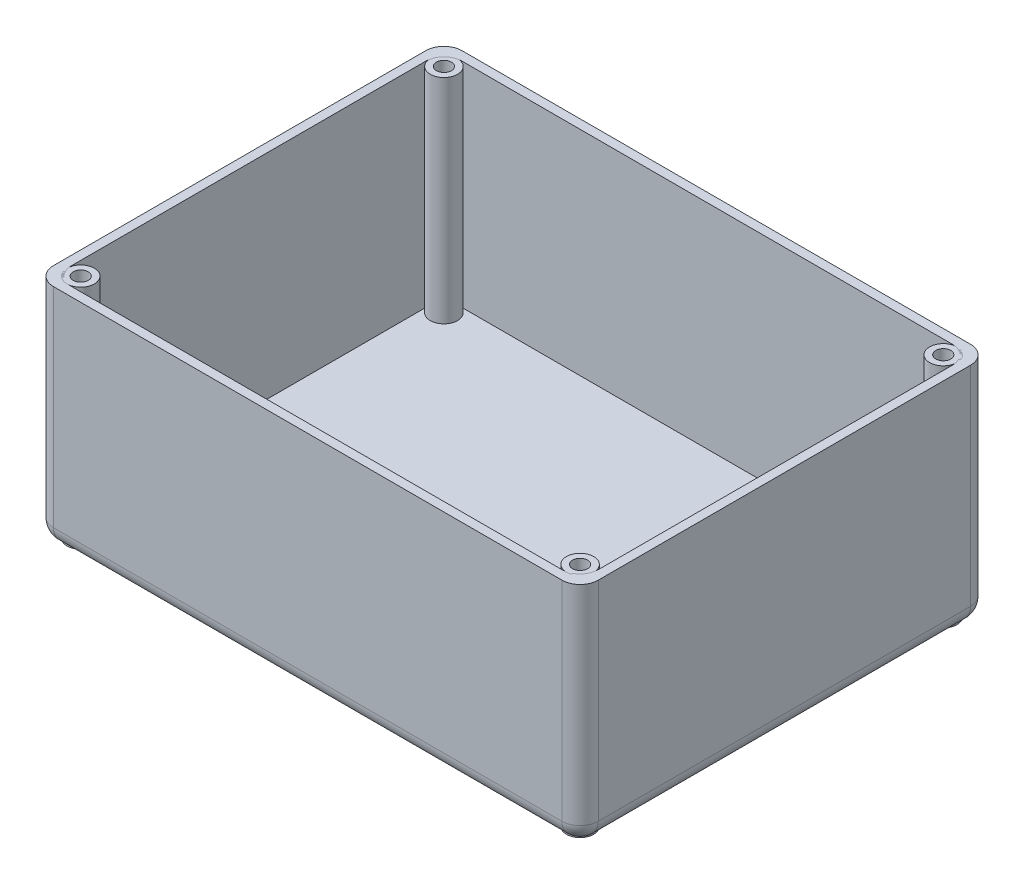
ISO-10303-21;
HEADER;
FILE_DESCRIPTION(('STEP AP214'),'2;1');
FILE_NAME('part.step','',(''),(''),'','','');
FILE_SCHEMA(('AUTOMOTIVE_DESIGN { 1 0 10303 214 1 1 1 1 }'));
ENDSEC;
DATA;
#1=APPLICATION_CONTEXT('core data for automotive mechanical design processes');
#2=APPLICATION_PROTOCOL_DEFINITION('international standard','automotive_design',2000,#1);
#3=PRODUCT_CONTEXT('',#1,'mechanical');
#4=PRODUCT('Part','Part','',(#3));
#5=PRODUCT_RELATED_PRODUCT_CATEGORY('part','',(#4));
#6=PRODUCT_DEFINITION_FORMATION('','',#4);
#7=PRODUCT_DEFINITION_CONTEXT('part definition',#1,'design');
#8=PRODUCT_DEFINITION('design','',#6,#7);
#9=PRODUCT_DEFINITION_SHAPE('','',#8);
#10=(LENGTH_UNIT() NAMED_UNIT(*) SI_UNIT(.MILLI.,.METRE.));
#11=(NAMED_UNIT(*) PLANE_ANGLE_UNIT() SI_UNIT($,.RADIAN.));
#12=(NAMED_UNIT(*) SI_UNIT($,.STERADIAN.) SOLID_ANGLE_UNIT());
#13=UNCERTAINTY_MEASURE_WITH_UNIT(LENGTH_MEASURE(1.E-05),#10,'distance_accuracy_value','');
#14=(GEOMETRIC_REPRESENTATION_CONTEXT(3) GLOBAL_UNCERTAINTY_ASSIGNED_CONTEXT((#13)) GLOBAL_UNIT_ASSIGNED_CONTEXT((#10,
#11,#12)) REPRESENTATION_CONTEXT('',''));
#15=CARTESIAN_POINT('',(0.,0.,0.));
#16=DIRECTION('',(0.,0.,1.));
#17=DIRECTION('',(1.,0.,0.));
#18=AXIS2_PLACEMENT_3D('',#15,#16,#17);
#19=CARTESIAN_POINT('',(39.9214659685864,50.,-28.4554973821989));
#20=DIRECTION('',(0.,-1.,0.));
#21=DIRECTION('',(0.,0.,-1.));
#22=AXIS2_PLACEMENT_3D('',#19,#20,#21);
#23=CYLINDRICAL_SURFACE('',#22,3.);
#24=CARTESIAN_POINT('',(39.9214659685864,50.,-28.4554973821989));
#25=DIRECTION('',(0.,-1.,0.));
#26=DIRECTION('',(0.,0.,-1.));
#27=AXIS2_PLACEMENT_3D('',#24,#25,#26);
#28=CIRCLE('',#27,3.);
#29=CARTESIAN_POINT('',(39.9214659685864,50.,-31.455497382199));
#30=VERTEX_POINT('',#29);
#31=EDGE_CURVE('E11',#30,#30,#28,.T.);
#32=ORIENTED_EDGE('',*,*,#31,.T.);
#33=EDGE_LOOP('',(#32));
#34=FACE_BOUND('',#33,.T.);
#35=CARTESIAN_POINT('',(39.9214659685864,0.,-28.4554973821989));
#36=DIRECTION('',(0.,-1.,0.));
#37=DIRECTION('',(0.,0.,-1.));
#38=AXIS2_PLACEMENT_3D('',#35,#36,#37);
#39=CIRCLE('',#38,3.);
#40=CARTESIAN_POINT('',(39.9214659685864,0.,-31.455497382199));
#41=VERTEX_POINT('',#40);
#42=EDGE_CURVE('E47',#41,#41,#39,.T.);
#43=ORIENTED_EDGE('',*,*,#42,.F.);
#44=EDGE_LOOP('',(#43));
#45=FACE_BOUND('',#44,.T.);
#46=ADVANCED_FACE('F44',(#34,#45),#23,.T.);
#47=CARTESIAN_POINT('',(39.9214659685864,50.,-28.4554973821989));
#48=DIRECTION('',(0.,-1.,0.));
#49=DIRECTION('',(0.,0.,-1.));
#50=AXIS2_PLACEMENT_3D('',#47,#48,#49);
#51=PLANE('',#50);
#52=CARTESIAN_POINT('',(39.9214659685864,50.,-28.4554973821989));
#53=DIRECTION('',(0.,-1.,0.));
#54=DIRECTION('',(0.,0.,-1.));
#55=AXIS2_PLACEMENT_3D('',#52,#53,#54);
#56=CIRCLE('',#55,1.65);
#57=CARTESIAN_POINT('',(39.9214659685864,50.,-30.105497382199));
#58=VERTEX_POINT('',#57);
#59=EDGE_CURVE('E54',#58,#58,#56,.T.);
#60=ORIENTED_EDGE('',*,*,#59,.T.);
#61=EDGE_LOOP('',(#60));
#62=FACE_BOUND('',#61,.T.);
#63=ORIENTED_EDGE('',*,*,#31,.F.);
#64=EDGE_LOOP('',(#63));
#65=FACE_BOUND('',#64,.T.);
#66=ADVANCED_FACE('F62',(#62,#65),#51,.F.);
#67=CARTESIAN_POINT('',(39.9214659685864,0.,-28.4554973821989));
#68=DIRECTION('',(0.,-1.,0.));
#69=DIRECTION('',(0.,0.,-1.));
#70=AXIS2_PLACEMENT_3D('',#67,#68,#69);
#71=PLANE('',#70);
#72=CARTESIAN_POINT('',(39.9214659685864,0.,-28.4554973821989));
#73=DIRECTION('',(0.,-1.,0.));
#74=DIRECTION('',(0.,0.,-1.));
#75=AXIS2_PLACEMENT_3D('',#72,#73,#74);
#76=CIRCLE('',#75,1.65);
#77=CARTESIAN_POINT('',(39.9214659685864,0.,-30.105497382199));
#78=VERTEX_POINT('',#77);
#79=EDGE_CURVE('E56',#78,#78,#76,.T.);
#80=ORIENTED_EDGE('',*,*,#79,.F.);
#81=EDGE_LOOP('',(#80));
#82=FACE_BOUND('',#81,.T.);
#83=ORIENTED_EDGE('',*,*,#42,.T.);
#84=EDGE_LOOP('',(#83));
#85=FACE_BOUND('',#84,.T.);
#86=ADVANCED_FACE('F68',(#82,#85),#71,.T.);
#87=CARTESIAN_POINT('',(39.9214659685864,50.,-28.4554973821989));
#88=DIRECTION('',(0.,-1.,0.));
#89=DIRECTION('',(0.,0.,-1.));
#90=AXIS2_PLACEMENT_3D('',#87,#88,#89);
#91=CYLINDRICAL_SURFACE('',#90,1.65);
#92=ORIENTED_EDGE('',*,*,#59,.F.);
#93=EDGE_LOOP('',(#92));
#94=FACE_BOUND('',#93,.T.);
#95=ORIENTED_EDGE('',*,*,#79,.T.);
#96=EDGE_LOOP('',(#95));
#97=FACE_BOUND('',#96,.T.);
#98=ADVANCED_FACE('F65',(#94,#97),#91,.F.);
#99=CLOSED_SHELL('',(#46,#66,#86,#98));
#100=MANIFOLD_SOLID_BREP('B2',#99);
#101=CARTESIAN_POINT('',(-70.0785340314136,50.,51.544502617801));
#102=DIRECTION('',(0.,-1.,0.));
#103=DIRECTION('',(0.,0.,-1.));
#104=AXIS2_PLACEMENT_3D('',#101,#102,#103);
#105=CYLINDRICAL_SURFACE('',#104,3.00000000000001);
#106=CARTESIAN_POINT('',(-70.0785340314136,50.,51.544502617801));
#107=DIRECTION('',(0.,-1.,0.));
#108=DIRECTION('',(0.,0.,-1.));
#109=AXIS2_PLACEMENT_3D('',#106,#107,#108);
#110=CIRCLE('',#109,3.00000000000001);
#111=CARTESIAN_POINT('',(-70.0785340314136,50.,48.544502617801));
#112=VERTEX_POINT('',#111);
#113=EDGE_CURVE('E43',#112,#112,#110,.T.);
#114=ORIENTED_EDGE('',*,*,#113,.T.);
#115=EDGE_LOOP('',(#114));
#116=FACE_BOUND('',#115,.T.);
#117=CARTESIAN_POINT('',(-70.0785340314136,0.,51.544502617801));
#118=DIRECTION('',(0.,-1.,0.));
#119=DIRECTION('',(0.,0.,-1.));
#120=AXIS2_PLACEMENT_3D('',#117,#118,#119);
#121=CIRCLE('',#120,3.00000000000001);
#122=CARTESIAN_POINT('',(-70.0785340314136,0.,48.544502617801));
#123=VERTEX_POINT('',#122);
#124=EDGE_CURVE('E117',#123,#123,#121,.T.);
#125=ORIENTED_EDGE('',*,*,#124,.F.);
#126=EDGE_LOOP('',(#125));
#127=FACE_BOUND('',#126,.T.);
#128=ADVANCED_FACE('F114',(#116,#127),#105,.T.);
#129=CARTESIAN_POINT('',(-70.0785340314136,50.,51.544502617801));
#130=DIRECTION('',(0.,-1.,0.));
#131=DIRECTION('',(0.,0.,-1.));
#132=AXIS2_PLACEMENT_3D('',#129,#130,#131);
#133=PLANE('',#132);
#134=CARTESIAN_POINT('',(-70.0785340314136,50.,51.544502617801));
#135=DIRECTION('',(0.,-1.,0.));
#136=DIRECTION('',(0.,0.,-1.));
#137=AXIS2_PLACEMENT_3D('',#134,#135,#136);
#138=CIRCLE('',#137,1.65);
#139=CARTESIAN_POINT('',(-70.0785340314136,50.,49.894502617801));
#140=VERTEX_POINT('',#139);
#141=EDGE_CURVE('E124',#140,#140,#138,.T.);
#142=ORIENTED_EDGE('',*,*,#141,.T.);
#143=EDGE_LOOP('',(#142));
#144=FACE_BOUND('',#143,.T.);
#145=ORIENTED_EDGE('',*,*,#113,.F.);
#146=EDGE_LOOP('',(#145));
#147=FACE_BOUND('',#146,.T.);
#148=ADVANCED_FACE('F132',(#144,#147),#133,.F.);
#149=CARTESIAN_POINT('',(-70.0785340314136,0.,51.544502617801));
#150=DIRECTION('',(0.,-1.,0.));
#151=DIRECTION('',(0.,0.,-1.));
#152=AXIS2_PLACEMENT_3D('',#149,#150,#151);
#153=PLANE('',#152);
#154=CARTESIAN_POINT('',(-70.0785340314136,0.,51.544502617801));
#155=DIRECTION('',(0.,-1.,0.));
#156=DIRECTION('',(0.,0.,-1.));
#157=AXIS2_PLACEMENT_3D('',#154,#155,#156);
#158=CIRCLE('',#157,1.65);
#159=CARTESIAN_POINT('',(-70.0785340314136,0.,49.894502617801));
#160=VERTEX_POINT('',#159);
#161=EDGE_CURVE('E126',#160,#160,#158,.T.);
#162=ORIENTED_EDGE('',*,*,#161,.F.);
#163=EDGE_LOOP('',(#162));
#164=FACE_BOUND('',#163,.T.);
#165=ORIENTED_EDGE('',*,*,#124,.T.);
#166=EDGE_LOOP('',(#165));
#167=FACE_BOUND('',#166,.T.);
#168=ADVANCED_FACE('F138',(#164,#167),#153,.T.);
#169=CARTESIAN_POINT('',(-70.0785340314136,50.,51.544502617801));
#170=DIRECTION('',(0.,-1.,0.));
#171=DIRECTION('',(0.,0.,-1.));
#172=AXIS2_PLACEMENT_3D('',#169,#170,#171);
#173=CYLINDRICAL_SURFACE('',#172,1.65);
#174=ORIENTED_EDGE('',*,*,#141,.F.);
#175=EDGE_LOOP('',(#174));
#176=FACE_BOUND('',#175,.T.);
#177=ORIENTED_EDGE('',*,*,#161,.T.);
#178=EDGE_LOOP('',(#177));
#179=FACE_BOUND('',#178,.T.);
#180=ADVANCED_FACE('F135',(#176,#179),#173,.F.);
#181=CLOSED_SHELL('',(#128,#148,#168,#180));
#182=MANIFOLD_SOLID_BREP('B6',#181);
#183=CARTESIAN_POINT('',(-70.0785340314136,50.,-28.455497382199));
#184=DIRECTION('',(0.,-1.,0.));
#185=DIRECTION('',(0.,0.,-1.));
#186=AXIS2_PLACEMENT_3D('',#183,#184,#185);
#187=CYLINDRICAL_SURFACE('',#186,3.00000000000001);
#188=CARTESIAN_POINT('',(-70.0785340314136,50.,-28.455497382199));
#189=DIRECTION('',(0.,-1.,0.));
#190=DIRECTION('',(0.,0.,-1.));
#191=AXIS2_PLACEMENT_3D('',#188,#189,#190);
#192=CIRCLE('',#191,3.00000000000001);
#193=CARTESIAN_POINT('',(-70.0785340314136,50.,-31.455497382199));
#194=VERTEX_POINT('',#193);
#195=EDGE_CURVE('E113',#194,#194,#192,.T.);
#196=ORIENTED_EDGE('',*,*,#195,.T.);
#197=EDGE_LOOP('',(#196));
#198=FACE_BOUND('',#197,.T.);
#199=CARTESIAN_POINT('',(-70.0785340314136,0.,-28.455497382199));
#200=DIRECTION('',(0.,-1.,0.));
#201=DIRECTION('',(0.,0.,-1.));
#202=AXIS2_PLACEMENT_3D('',#199,#200,#201);
#203=CIRCLE('',#202,3.00000000000001);
#204=CARTESIAN_POINT('',(-70.0785340314136,0.,-31.455497382199));
#205=VERTEX_POINT('',#204);
#206=EDGE_CURVE('E187',#205,#205,#203,.T.);
#207=ORIENTED_EDGE('',*,*,#206,.F.);
#208=EDGE_LOOP('',(#207));
#209=FACE_BOUND('',#208,.T.);
#210=ADVANCED_FACE('F184',(#198,#209),#187,.T.);
#211=CARTESIAN_POINT('',(-70.0785340314136,50.,-28.455497382199));
#212=DIRECTION('',(0.,-1.,0.));
#213=DIRECTION('',(0.,0.,-1.));
#214=AXIS2_PLACEMENT_3D('',#211,#212,#213);
#215=PLANE('',#214);
#216=CARTESIAN_POINT('',(-70.0785340314136,50.,-28.455497382199));
#217=DIRECTION('',(0.,-1.,0.));
#218=DIRECTION('',(0.,0.,-1.));
#219=AXIS2_PLACEMENT_3D('',#216,#217,#218);
#220=CIRCLE('',#219,1.65);
#221=CARTESIAN_POINT('',(-70.0785340314136,50.,-30.105497382199));
#222=VERTEX_POINT('',#221);
#223=EDGE_CURVE('E194',#222,#222,#220,.T.);
#224=ORIENTED_EDGE('',*,*,#223,.T.);
#225=EDGE_LOOP('',(#224));
#226=FACE_BOUND('',#225,.T.);
#227=ORIENTED_EDGE('',*,*,#195,.F.);
#228=EDGE_LOOP('',(#227));
#229=FACE_BOUND('',#228,.T.);
#230=ADVANCED_FACE('F202',(#226,#229),#215,.F.);
#231=CARTESIAN_POINT('',(-70.0785340314136,0.,-28.455497382199));
#232=DIRECTION('',(0.,-1.,0.));
#233=DIRECTION('',(0.,0.,-1.));
#234=AXIS2_PLACEMENT_3D('',#231,#232,#233);
#235=PLANE('',#234);
#236=CARTESIAN_POINT('',(-70.0785340314136,0.,-28.455497382199));
#237=DIRECTION('',(0.,-1.,0.));
#238=DIRECTION('',(0.,0.,-1.));
#239=AXIS2_PLACEMENT_3D('',#236,#237,#238);
#240=CIRCLE('',#239,1.65);
#241=CARTESIAN_POINT('',(-70.0785340314136,0.,-30.105497382199));
#242=VERTEX_POINT('',#241);
#243=EDGE_CURVE('E196',#242,#242,#240,.T.);
#244=ORIENTED_EDGE('',*,*,#243,.F.);
#245=EDGE_LOOP('',(#244));
#246=FACE_BOUND('',#245,.T.);
#247=ORIENTED_EDGE('',*,*,#206,.T.);
#248=EDGE_LOOP('',(#247));
#249=FACE_BOUND('',#248,.T.);
#250=ADVANCED_FACE('F208',(#246,#249),#235,.T.);
#251=CARTESIAN_POINT('',(-70.0785340314136,50.,-28.455497382199));
#252=DIRECTION('',(0.,-1.,0.));
#253=DIRECTION('',(0.,0.,-1.));
#254=AXIS2_PLACEMENT_3D('',#251,#252,#253);
#255=CYLINDRICAL_SURFACE('',#254,1.65);
#256=ORIENTED_EDGE('',*,*,#223,.F.);
#257=EDGE_LOOP('',(#256));
#258=FACE_BOUND('',#257,.T.);
#259=ORIENTED_EDGE('',*,*,#243,.T.);
#260=EDGE_LOOP('',(#259));
#261=FACE_BOUND('',#260,.T.);
#262=ADVANCED_FACE('F205',(#258,#261),#255,.F.);
#263=CLOSED_SHELL('',(#210,#230,#250,#262));
#264=MANIFOLD_SOLID_BREP('B38',#263);
#265=CARTESIAN_POINT('',(39.9214659685864,50.,51.544502617801));
#266=DIRECTION('',(0.,-1.,0.));
#267=DIRECTION('',(0.,0.,-1.));
#268=AXIS2_PLACEMENT_3D('',#265,#266,#267);
#269=CYLINDRICAL_SURFACE('',#268,3.);
#270=CARTESIAN_POINT('',(39.9214659685864,50.,51.544502617801));
#271=DIRECTION('',(0.,-1.,0.));
#272=DIRECTION('',(0.,0.,-1.));
#273=AXIS2_PLACEMENT_3D('',#270,#271,#272);
#274=CIRCLE('',#273,3.);
#275=CARTESIAN_POINT('',(39.9214659685864,50.,48.544502617801));
#276=VERTEX_POINT('',#275);
#277=EDGE_CURVE('E183',#276,#276,#274,.T.);
#278=ORIENTED_EDGE('',*,*,#277,.T.);
#279=EDGE_LOOP('',(#278));
#280=FACE_BOUND('',#279,.T.);
#281=CARTESIAN_POINT('',(39.9214659685864,0.,51.544502617801));
#282=DIRECTION('',(0.,-1.,0.));
#283=DIRECTION('',(0.,0.,-1.));
#284=AXIS2_PLACEMENT_3D('',#281,#282,#283);
#285=CIRCLE('',#284,3.);
#286=CARTESIAN_POINT('',(39.9214659685864,0.,48.544502617801));
#287=VERTEX_POINT('',#286);
#288=EDGE_CURVE('E258',#287,#287,#285,.T.);
#289=ORIENTED_EDGE('',*,*,#288,.F.);
#290=EDGE_LOOP('',(#289));
#291=FACE_BOUND('',#290,.T.);
#292=ADVANCED_FACE('F255',(#280,#291),#269,.T.);
#293=CARTESIAN_POINT('',(39.9214659685864,50.,51.544502617801));
#294=DIRECTION('',(0.,-1.,0.));
#295=DIRECTION('',(0.,0.,-1.));
#296=AXIS2_PLACEMENT_3D('',#293,#294,#295);
#297=PLANE('',#296);
#298=CARTESIAN_POINT('',(39.9214659685864,50.,51.544502617801));
#299=DIRECTION('',(0.,-1.,0.));
#300=DIRECTION('',(0.,0.,-1.));
#301=AXIS2_PLACEMENT_3D('',#298,#299,#300);
#302=CIRCLE('',#301,1.65);
#303=CARTESIAN_POINT('',(39.9214659685864,50.,49.894502617801));
#304=VERTEX_POINT('',#303);
#305=EDGE_CURVE('E265',#304,#304,#302,.T.);
#306=ORIENTED_EDGE('',*,*,#305,.T.);
#307=EDGE_LOOP('',(#306));
#308=FACE_BOUND('',#307,.T.);
#309=ORIENTED_EDGE('',*,*,#277,.F.);
#310=EDGE_LOOP('',(#309));
#311=FACE_BOUND('',#310,.T.);
#312=ADVANCED_FACE('F273',(#308,#311),#297,.F.);
#313=CARTESIAN_POINT('',(39.9214659685864,0.,51.544502617801));
#314=DIRECTION('',(0.,-1.,0.));
#315=DIRECTION('',(0.,0.,-1.));
#316=AXIS2_PLACEMENT_3D('',#313,#314,#315);
#317=PLANE('',#316);
#318=CARTESIAN_POINT('',(39.9214659685864,0.,51.544502617801));
#319=DIRECTION('',(0.,-1.,0.));
#320=DIRECTION('',(0.,0.,-1.));
#321=AXIS2_PLACEMENT_3D('',#318,#319,#320);
#322=CIRCLE('',#321,1.65);
#323=CARTESIAN_POINT('',(39.9214659685864,0.,49.894502617801));
#324=VERTEX_POINT('',#323);
#325=EDGE_CURVE('E267',#324,#324,#322,.T.);
#326=ORIENTED_EDGE('',*,*,#325,.F.);
#327=EDGE_LOOP('',(#326));
#328=FACE_BOUND('',#327,.T.);
#329=ORIENTED_EDGE('',*,*,#288,.T.);
#330=EDGE_LOOP('',(#329));
#331=FACE_BOUND('',#330,.T.);
#332=ADVANCED_FACE('F279',(#328,#331),#317,.T.);
#333=CARTESIAN_POINT('',(39.9214659685864,50.,51.544502617801));
#334=DIRECTION('',(0.,-1.,0.));
#335=DIRECTION('',(0.,0.,-1.));
#336=AXIS2_PLACEMENT_3D('',#333,#334,#335);
#337=CYLINDRICAL_SURFACE('',#336,1.65);
#338=ORIENTED_EDGE('',*,*,#305,.F.);
#339=EDGE_LOOP('',(#338));
#340=FACE_BOUND('',#339,.T.);
#341=ORIENTED_EDGE('',*,*,#325,.T.);
#342=EDGE_LOOP('',(#341));
#343=FACE_BOUND('',#342,.T.);
#344=ADVANCED_FACE('F276',(#340,#343),#337,.F.);
#345=CLOSED_SHELL('',(#292,#312,#332,#344));
#346=MANIFOLD_SOLID_BREP('B108',#345);
#347=CARTESIAN_POINT('',(-75.0785340314136,50.,-33.455497382199));
#348=DIRECTION('',(1.,0.,0.));
#349=DIRECTION('',(0.,0.,-1.));
#350=AXIS2_PLACEMENT_3D('',#347,#348,#349);
#351=PLANE('',#350);
#352=DIRECTION('',(0.,-1.,0.));
#353=VECTOR('',#352,1.);
#354=CARTESIAN_POINT('',(-75.0785340314136,50.,-29.455497382199));
#355=LINE('',#354,#353);
#356=CARTESIAN_POINT('',(-75.0785340314136,50.,-29.455497382199));
#357=VERTEX_POINT('',#356);
#358=CARTESIAN_POINT('',(-75.0785340314136,4.,-29.455497382199));
#359=VERTEX_POINT('',#358);
#360=EDGE_CURVE('E483',#357,#359,#355,.T.);
#361=ORIENTED_EDGE('',*,*,#360,.T.);
#362=DIRECTION('',(0.,0.,1.));
#363=VECTOR('',#362,1.);
#364=CARTESIAN_POINT('',(-75.0785340314136,4.,-33.455497382199));
#365=LINE('',#364,#363);
#366=CARTESIAN_POINT('',(-75.0785340314136,4.,52.544502617801));
#367=VERTEX_POINT('',#366);
#368=EDGE_CURVE('E511',#359,#367,#365,.T.);
#369=ORIENTED_EDGE('',*,*,#368,.T.);
#370=DIRECTION('',(0.,-1.,0.));
#371=VECTOR('',#370,1.);
#372=CARTESIAN_POINT('',(-75.0785340314136,50.,52.544502617801));
#373=LINE('',#372,#371);
#374=CARTESIAN_POINT('',(-75.0785340314136,50.,52.544502617801));
#375=VERTEX_POINT('',#374);
#376=EDGE_CURVE('E486',#367,#375,#373,.F.);
#377=ORIENTED_EDGE('',*,*,#376,.T.);
#378=DIRECTION('',(0.,0.,1.));
#379=VECTOR('',#378,1.);
#380=CARTESIAN_POINT('',(-75.0785340314136,50.,-33.455497382199));
#381=LINE('',#380,#379);
#382=EDGE_CURVE('E592',#357,#375,#381,.T.);
#383=ORIENTED_EDGE('',*,*,#382,.F.);
#384=EDGE_LOOP('',(#361,#369,#377,#383));
#385=FACE_BOUND('',#384,.T.);
#386=ADVANCED_FACE('F317',(#385),#351,.F.);
#387=CARTESIAN_POINT('',(-75.0785340314136,50.,56.544502617801));
#388=DIRECTION('',(0.,0.,-1.));
#389=DIRECTION('',(-1.,0.,0.));
#390=AXIS2_PLACEMENT_3D('',#387,#388,#389);
#391=PLANE('',#390);
#392=DIRECTION('',(0.,-1.,0.));
#393=VECTOR('',#392,1.);
#394=CARTESIAN_POINT('',(-71.0785340314136,50.,56.544502617801));
#395=LINE('',#394,#393);
#396=CARTESIAN_POINT('',(-71.0785340314136,50.,56.544502617801));
#397=VERTEX_POINT('',#396);
#398=CARTESIAN_POINT('',(-71.0785340314136,4.,56.544502617801));
#399=VERTEX_POINT('',#398);
#400=EDGE_CURVE('E452',#397,#399,#395,.T.);
#401=ORIENTED_EDGE('',*,*,#400,.T.);
#402=DIRECTION('',(1.,0.,0.));
#403=VECTOR('',#402,1.);
#404=CARTESIAN_POINT('',(-75.0785340314136,4.,56.544502617801));
#405=LINE('',#404,#403);
#406=CARTESIAN_POINT('',(40.9214659685864,4.,56.544502617801));
#407=VERTEX_POINT('',#406);
#408=EDGE_CURVE('E507',#399,#407,#405,.T.);
#409=ORIENTED_EDGE('',*,*,#408,.T.);
#410=DIRECTION('',(0.,-1.,0.));
#411=VECTOR('',#410,1.);
#412=CARTESIAN_POINT('',(40.9214659685864,50.,56.544502617801));
#413=LINE('',#412,#411);
#414=CARTESIAN_POINT('',(40.9214659685864,50.,56.544502617801));
#415=VERTEX_POINT('',#414);
#416=EDGE_CURVE('E481',#407,#415,#413,.F.);
#417=ORIENTED_EDGE('',*,*,#416,.T.);
#418=DIRECTION('',(1.,0.,0.));
#419=VECTOR('',#418,1.);
#420=CARTESIAN_POINT('',(-75.0785340314136,50.,56.544502617801));
#421=LINE('',#420,#419);
#422=EDGE_CURVE('E606',#397,#415,#421,.T.);
#423=ORIENTED_EDGE('',*,*,#422,.F.);
#424=EDGE_LOOP('',(#401,#409,#417,#423));
#425=FACE_BOUND('',#424,.T.);
#426=ADVANCED_FACE('F662',(#425),#391,.F.);
#427=CARTESIAN_POINT('',(44.9214659685864,50.,-33.455497382199));
#428=DIRECTION('',(-1.,0.,0.));
#429=DIRECTION('',(0.,0.,1.));
#430=AXIS2_PLACEMENT_3D('',#427,#428,#429);
#431=PLANE('',#430);
#432=DIRECTION('',(0.,-1.,0.));
#433=VECTOR('',#432,1.);
#434=CARTESIAN_POINT('',(44.9214659685864,50.,52.544502617801));
#435=LINE('',#434,#433);
#436=CARTESIAN_POINT('',(44.9214659685864,50.,52.544502617801));
#437=VERTEX_POINT('',#436);
#438=CARTESIAN_POINT('',(44.9214659685864,4.,52.544502617801));
#439=VERTEX_POINT('',#438);
#440=EDGE_CURVE('E466',#437,#439,#435,.T.);
#441=ORIENTED_EDGE('',*,*,#440,.T.);
#442=DIRECTION('',(0.,0.,-1.));
#443=VECTOR('',#442,1.);
#444=CARTESIAN_POINT('',(44.9214659685864,4.,-33.455497382199));
#445=LINE('',#444,#443);
#446=CARTESIAN_POINT('',(44.9214659685864,4.,-29.455497382199));
#447=VERTEX_POINT('',#446);
#448=EDGE_CURVE('E503',#439,#447,#445,.T.);
#449=ORIENTED_EDGE('',*,*,#448,.T.);
#450=DIRECTION('',(0.,-1.,0.));
#451=VECTOR('',#450,1.);
#452=CARTESIAN_POINT('',(44.9214659685864,50.,-29.455497382199));
#453=LINE('',#452,#451);
#454=CARTESIAN_POINT('',(44.9214659685864,50.,-29.455497382199));
#455=VERTEX_POINT('',#454);
#456=EDGE_CURVE('E469',#447,#455,#453,.F.);
#457=ORIENTED_EDGE('',*,*,#456,.T.);
#458=DIRECTION('',(0.,0.,-1.));
#459=VECTOR('',#458,1.);
#460=CARTESIAN_POINT('',(44.9214659685864,50.,-33.455497382199));
#461=LINE('',#460,#459);
#462=EDGE_CURVE('E448',#437,#455,#461,.T.);
#463=ORIENTED_EDGE('',*,*,#462,.F.);
#464=EDGE_LOOP('',(#441,#449,#457,#463));
#465=FACE_BOUND('',#464,.T.);
#466=ADVANCED_FACE('F621',(#465),#431,.F.);
#467=CARTESIAN_POINT('',(-75.0785340314136,50.,-33.455497382199));
#468=DIRECTION('',(0.,0.,1.));
#469=DIRECTION('',(1.,0.,0.));
#470=AXIS2_PLACEMENT_3D('',#467,#468,#469);
#471=PLANE('',#470);
#472=DIRECTION('',(0.,-1.,0.));
#473=VECTOR('',#472,1.);
#474=CARTESIAN_POINT('',(40.9214659685864,50.,-33.455497382199));
#475=LINE('',#474,#473);
#476=CARTESIAN_POINT('',(40.9214659685863,50.,-33.455497382199));
#477=VERTEX_POINT('',#476);
#478=CARTESIAN_POINT('',(40.9214659685864,4.,-33.455497382199));
#479=VERTEX_POINT('',#478);
#480=EDGE_CURVE('E458',#477,#479,#475,.T.);
#481=ORIENTED_EDGE('',*,*,#480,.T.);
#482=DIRECTION('',(-1.,0.,0.));
#483=VECTOR('',#482,1.);
#484=CARTESIAN_POINT('',(-75.0785340314136,4.,-33.455497382199));
#485=LINE('',#484,#483);
#486=CARTESIAN_POINT('',(-71.0785340314136,4.,-33.455497382199));
#487=VERTEX_POINT('',#486);
#488=EDGE_CURVE('E491',#479,#487,#485,.T.);
#489=ORIENTED_EDGE('',*,*,#488,.T.);
#490=DIRECTION('',(0.,-1.,0.));
#491=VECTOR('',#490,1.);
#492=CARTESIAN_POINT('',(-71.0785340314136,50.,-33.455497382199));
#493=LINE('',#492,#491);
#494=CARTESIAN_POINT('',(-71.0785340314136,50.,-33.455497382199));
#495=VERTEX_POINT('',#494);
#496=EDGE_CURVE('E461',#487,#495,#493,.F.);
#497=ORIENTED_EDGE('',*,*,#496,.T.);
#498=DIRECTION('',(-1.,0.,0.));
#499=VECTOR('',#498,1.);
#500=CARTESIAN_POINT('',(-75.0785340314136,50.,-33.455497382199));
#501=LINE('',#500,#499);
#502=EDGE_CURVE('E445',#477,#495,#501,.T.);
#503=ORIENTED_EDGE('',*,*,#502,.F.);
#504=EDGE_LOOP('',(#481,#489,#497,#503));
#505=FACE_BOUND('',#504,.T.);
#506=ADVANCED_FACE('F457',(#505),#471,.F.);
#507=CARTESIAN_POINT('',(0.,50.,0.));
#508=DIRECTION('',(0.,1.,0.));
#509=DIRECTION('',(0.,0.,1.));
#510=AXIS2_PLACEMENT_3D('',#507,#508,#509);
#511=PLANE('',#510);
#512=DIRECTION('',(0.,0.,1.));
#513=VECTOR('',#512,1.);
#514=CARTESIAN_POINT('',(-73.0785340314136,50.,-31.455497382199));
#515=LINE('',#514,#513);
#516=CARTESIAN_POINT('',(-73.0785340314136,50.,-27.455497382199));
#517=VERTEX_POINT('',#516);
#518=CARTESIAN_POINT('',(-73.0785340314136,50.,50.544502617801));
#519=VERTEX_POINT('',#518);
#520=EDGE_CURVE('E536',#517,#519,#515,.T.);
#521=ORIENTED_EDGE('',*,*,#520,.F.);
#522=CARTESIAN_POINT('',(-69.0785340314136,50.,-27.455497382199));
#523=DIRECTION('',(0.,1.,0.));
#524=DIRECTION('',(0.,0.,1.));
#525=AXIS2_PLACEMENT_3D('',#522,#523,#524);
#526=CIRCLE('',#525,4.);
#527=CARTESIAN_POINT('',(-69.0785340314136,50.,-31.455497382199));
#528=VERTEX_POINT('',#527);
#529=EDGE_CURVE('E563',#517,#528,#526,.F.);
#530=ORIENTED_EDGE('',*,*,#529,.T.);
#531=DIRECTION('',(-1.,0.,0.));
#532=VECTOR('',#531,1.);
#533=CARTESIAN_POINT('',(-73.0785340314136,50.,-31.455497382199));
#534=LINE('',#533,#532);
#535=CARTESIAN_POINT('',(38.9214659685864,50.,-31.4554973821989));
#536=VERTEX_POINT('',#535);
#537=EDGE_CURVE('E601',#536,#528,#534,.T.);
#538=ORIENTED_EDGE('',*,*,#537,.F.);
#539=CARTESIAN_POINT('',(38.9214659685864,50.,-27.4554973821989));
#540=DIRECTION('',(0.,1.,0.));
#541=DIRECTION('',(0.,0.,1.));
#542=AXIS2_PLACEMENT_3D('',#539,#540,#541);
#543=CIRCLE('',#542,4.);
#544=CARTESIAN_POINT('',(42.9214659685864,50.,-27.4554973821989));
#545=VERTEX_POINT('',#544);
#546=EDGE_CURVE('E253',#536,#545,#543,.F.);
#547=ORIENTED_EDGE('',*,*,#546,.T.);
#548=DIRECTION('',(0.,0.,-1.));
#549=VECTOR('',#548,1.);
#550=CARTESIAN_POINT('',(42.9214659685864,50.,-31.4554973821989));
#551=LINE('',#550,#549);
#552=CARTESIAN_POINT('',(42.9214659685864,50.,50.544502617801));
#553=VERTEX_POINT('',#552);
#554=EDGE_CURVE('E570',#553,#545,#551,.T.);
#555=ORIENTED_EDGE('',*,*,#554,.F.);
#556=CARTESIAN_POINT('',(38.9214659685864,50.,50.544502617801));
#557=DIRECTION('',(0.,1.,0.));
#558=DIRECTION('',(0.,0.,1.));
#559=AXIS2_PLACEMENT_3D('',#556,#557,#558);
#560=CIRCLE('',#559,4.);
#561=CARTESIAN_POINT('',(38.9214659685864,50.,54.5445026178011));
#562=VERTEX_POINT('',#561);
#563=EDGE_CURVE('E325',#553,#562,#560,.F.);
#564=ORIENTED_EDGE('',*,*,#563,.T.);
#565=DIRECTION('',(1.,0.,0.));
#566=VECTOR('',#565,1.);
#567=CARTESIAN_POINT('',(-73.0785340314136,50.,54.544502617801));
#568=LINE('',#567,#566);
#569=CARTESIAN_POINT('',(-69.0785340314136,50.,54.544502617801));
#570=VERTEX_POINT('',#569);
#571=EDGE_CURVE('E569',#570,#562,#568,.T.);
#572=ORIENTED_EDGE('',*,*,#571,.F.);
#573=CARTESIAN_POINT('',(-69.0785340314136,50.,50.544502617801));
#574=DIRECTION('',(0.,1.,0.));
#575=DIRECTION('',(0.,0.,1.));
#576=AXIS2_PLACEMENT_3D('',#573,#574,#575);
#577=CIRCLE('',#576,4.);
#578=EDGE_CURVE('E565',#570,#519,#577,.F.);
#579=ORIENTED_EDGE('',*,*,#578,.T.);
#580=EDGE_LOOP('',(#521,#530,#538,#547,#555,#564,#572,#579));
#581=FACE_BOUND('',#580,.T.);
#582=ORIENTED_EDGE('',*,*,#462,.T.);
#583=CARTESIAN_POINT('',(40.9214659685864,50.,-29.455497382199));
#584=DIRECTION('',(0.,1.,0.));
#585=DIRECTION('',(0.,0.,1.));
#586=AXIS2_PLACEMENT_3D('',#583,#584,#585);
#587=CIRCLE('',#586,4.);
#588=EDGE_CURVE('E442',#455,#477,#587,.T.);
#589=ORIENTED_EDGE('',*,*,#588,.T.);
#590=ORIENTED_EDGE('',*,*,#502,.T.);
#591=CARTESIAN_POINT('',(-71.0785340314136,50.,-29.455497382199));
#592=DIRECTION('',(0.,1.,0.));
#593=DIRECTION('',(0.,0.,1.));
#594=AXIS2_PLACEMENT_3D('',#591,#592,#593);
#595=CIRCLE('',#594,4.);
#596=EDGE_CURVE('E474',#495,#357,#595,.T.);
#597=ORIENTED_EDGE('',*,*,#596,.T.);
#598=ORIENTED_EDGE('',*,*,#382,.T.);
#599=CARTESIAN_POINT('',(-71.0785340314136,50.,52.544502617801));
#600=DIRECTION('',(0.,1.,0.));
#601=DIRECTION('',(0.,0.,1.));
#602=AXIS2_PLACEMENT_3D('',#599,#600,#601);
#603=CIRCLE('',#602,4.);
#604=EDGE_CURVE('E476',#375,#397,#603,.T.);
#605=ORIENTED_EDGE('',*,*,#604,.T.);
#606=ORIENTED_EDGE('',*,*,#422,.T.);
#607=CARTESIAN_POINT('',(40.9214659685864,50.,52.544502617801));
#608=DIRECTION('',(0.,1.,0.));
#609=DIRECTION('',(0.,0.,1.));
#610=AXIS2_PLACEMENT_3D('',#607,#608,#609);
#611=CIRCLE('',#610,4.);
#612=EDGE_CURVE('E453',#415,#437,#611,.T.);
#613=ORIENTED_EDGE('',*,*,#612,.T.);
#614=EDGE_LOOP('',(#582,#589,#590,#597,#598,#605,#606,#613));
#615=FACE_BOUND('',#614,.T.);
#616=ADVANCED_FACE('F444',(#581,#615),#511,.T.);
#617=CARTESIAN_POINT('',(0.,0.,0.));
#618=DIRECTION('',(0.,1.,0.));
#619=DIRECTION('',(0.,0.,1.));
#620=AXIS2_PLACEMENT_3D('',#617,#618,#619);
#621=PLANE('',#620);
#622=DIRECTION('',(0.,0.,1.));
#623=VECTOR('',#622,1.);
#624=CARTESIAN_POINT('',(-71.0785340314136,0.,0.));
#625=LINE('',#624,#623);
#626=CARTESIAN_POINT('',(-71.0785340314136,0.,52.544502617801));
#627=VERTEX_POINT('',#626);
#628=CARTESIAN_POINT('',(-71.0785340314136,0.,-29.455497382199));
#629=VERTEX_POINT('',#628);
#630=EDGE_CURVE('E493',#627,#629,#625,.F.);
#631=ORIENTED_EDGE('',*,*,#630,.T.);
#632=DIRECTION('',(-1.,0.,0.));
#633=VECTOR('',#632,1.);
#634=CARTESIAN_POINT('',(0.,0.,-29.455497382199));
#635=LINE('',#634,#633);
#636=CARTESIAN_POINT('',(40.9214659685864,0.,-29.455497382199));
#637=VERTEX_POINT('',#636);
#638=EDGE_CURVE('E499',#629,#637,#635,.F.);
#639=ORIENTED_EDGE('',*,*,#638,.T.);
#640=DIRECTION('',(0.,0.,-1.));
#641=VECTOR('',#640,1.);
#642=CARTESIAN_POINT('',(40.9214659685864,0.,0.));
#643=LINE('',#642,#641);
#644=CARTESIAN_POINT('',(40.9214659685864,0.,52.544502617801));
#645=VERTEX_POINT('',#644);
#646=EDGE_CURVE('E497',#637,#645,#643,.F.);
#647=ORIENTED_EDGE('',*,*,#646,.T.);
#648=DIRECTION('',(1.,0.,0.));
#649=VECTOR('',#648,1.);
#650=CARTESIAN_POINT('',(0.,0.,52.544502617801));
#651=LINE('',#650,#649);
#652=EDGE_CURVE('E495',#645,#627,#651,.F.);
#653=ORIENTED_EDGE('',*,*,#652,.T.);
#654=EDGE_LOOP('',(#631,#639,#647,#653));
#655=FACE_BOUND('',#654,.T.);
#656=ADVANCED_FACE('F725',(#655),#621,.F.);
#657=CARTESIAN_POINT('',(-73.0785340314136,3.,-31.455497382199));
#658=DIRECTION('',(-1.,0.,0.));
#659=DIRECTION('',(0.,0.,1.));
#660=AXIS2_PLACEMENT_3D('',#657,#658,#659);
#661=PLANE('',#660);
#662=DIRECTION('',(0.,0.,1.));
#663=VECTOR('',#662,1.);
#664=CARTESIAN_POINT('',(-73.0785340314136,3.,-31.455497382199));
#665=LINE('',#664,#663);
#666=CARTESIAN_POINT('',(-73.0785340314136,3.,-27.455497382199));
#667=VERTEX_POINT('',#666);
#668=CARTESIAN_POINT('',(-73.0785340314136,3.,50.544502617801));
#669=VERTEX_POINT('',#668);
#670=EDGE_CURVE('E594',#667,#669,#665,.T.);
#671=ORIENTED_EDGE('',*,*,#670,.F.);
#672=DIRECTION('',(0.,1.,0.));
#673=VECTOR('',#672,1.);
#674=CARTESIAN_POINT('',(-73.0785340314136,50.,-27.455497382199));
#675=LINE('',#674,#673);
#676=EDGE_CURVE('E538',#667,#517,#675,.T.);
#677=ORIENTED_EDGE('',*,*,#676,.T.);
#678=ORIENTED_EDGE('',*,*,#520,.T.);
#679=DIRECTION('',(0.,1.,0.));
#680=VECTOR('',#679,1.);
#681=CARTESIAN_POINT('',(-73.0785340314136,3.,50.544502617801));
#682=LINE('',#681,#680);
#683=EDGE_CURVE('E513',#519,#669,#682,.F.);
#684=ORIENTED_EDGE('',*,*,#683,.T.);
#685=EDGE_LOOP('',(#671,#677,#678,#684));
#686=FACE_BOUND('',#685,.T.);
#687=ADVANCED_FACE('F722',(#686),#661,.F.);
#688=CARTESIAN_POINT('',(-73.0785340314136,3.,-31.455497382199));
#689=DIRECTION('',(0.,0.,-1.));
#690=DIRECTION('',(-1.,0.,0.));
#691=AXIS2_PLACEMENT_3D('',#688,#689,#690);
#692=PLANE('',#691);
#693=ORIENTED_EDGE('',*,*,#537,.T.);
#694=DIRECTION('',(0.,1.,0.));
#695=VECTOR('',#694,1.);
#696=CARTESIAN_POINT('',(-69.0785340314136,3.,-31.455497382199));
#697=LINE('',#696,#695);
#698=CARTESIAN_POINT('',(-69.0785340314136,3.,-31.455497382199));
#699=VERTEX_POINT('',#698);
#700=EDGE_CURVE('E544',#528,#699,#697,.F.);
#701=ORIENTED_EDGE('',*,*,#700,.T.);
#702=DIRECTION('',(-1.,0.,0.));
#703=VECTOR('',#702,1.);
#704=CARTESIAN_POINT('',(-73.0785340314136,3.,-31.455497382199));
#705=LINE('',#704,#703);
#706=CARTESIAN_POINT('',(38.9214659685864,3.,-31.4554973821989));
#707=VERTEX_POINT('',#706);
#708=EDGE_CURVE('E590',#707,#699,#705,.T.);
#709=ORIENTED_EDGE('',*,*,#708,.F.);
#710=DIRECTION('',(0.,1.,0.));
#711=VECTOR('',#710,1.);
#712=CARTESIAN_POINT('',(38.9214659685864,50.,-31.4554973821989));
#713=LINE('',#712,#711);
#714=EDGE_CURVE('E541',#707,#536,#713,.T.);
#715=ORIENTED_EDGE('',*,*,#714,.T.);
#716=EDGE_LOOP('',(#693,#701,#709,#715));
#717=FACE_BOUND('',#716,.T.);
#718=ADVANCED_FACE('F715',(#717),#692,.F.);
#719=CARTESIAN_POINT('',(42.9214659685864,3.,-31.4554973821989));
#720=DIRECTION('',(1.,0.,0.));
#721=DIRECTION('',(0.,0.,-1.));
#722=AXIS2_PLACEMENT_3D('',#719,#720,#721);
#723=PLANE('',#722);
#724=DIRECTION('',(0.,0.,-1.));
#725=VECTOR('',#724,1.);
#726=CARTESIAN_POINT('',(42.9214659685864,3.,-31.4554973821989));
#727=LINE('',#726,#725);
#728=CARTESIAN_POINT('',(42.9214659685864,3.,50.544502617801));
#729=VERTEX_POINT('',#728);
#730=CARTESIAN_POINT('',(42.9214659685864,3.,-27.4554973821989));
#731=VERTEX_POINT('',#730);
#732=EDGE_CURVE('E584',#729,#731,#727,.T.);
#733=ORIENTED_EDGE('',*,*,#732,.F.);
#734=DIRECTION('',(0.,1.,0.));
#735=VECTOR('',#734,1.);
#736=CARTESIAN_POINT('',(42.9214659685864,50.,50.544502617801));
#737=LINE('',#736,#735);
#738=EDGE_CURVE('E561',#729,#553,#737,.T.);
#739=ORIENTED_EDGE('',*,*,#738,.T.);
#740=ORIENTED_EDGE('',*,*,#554,.T.);
#741=DIRECTION('',(0.,1.,0.));
#742=VECTOR('',#741,1.);
#743=CARTESIAN_POINT('',(42.9214659685864,3.,-27.4554973821989));
#744=LINE('',#743,#742);
#745=EDGE_CURVE('E559',#545,#731,#744,.F.);
#746=ORIENTED_EDGE('',*,*,#745,.T.);
#747=EDGE_LOOP('',(#733,#739,#740,#746));
#748=FACE_BOUND('',#747,.T.);
#749=ADVANCED_FACE('F588',(#748),#723,.F.);
#750=CARTESIAN_POINT('',(-73.0785340314136,3.,54.544502617801));
#751=DIRECTION('',(0.,0.,1.));
#752=DIRECTION('',(1.,0.,0.));
#753=AXIS2_PLACEMENT_3D('',#750,#751,#752);
#754=PLANE('',#753);
#755=DIRECTION('',(1.,0.,0.));
#756=VECTOR('',#755,1.);
#757=CARTESIAN_POINT('',(-73.0785340314136,3.,54.544502617801));
#758=LINE('',#757,#756);
#759=CARTESIAN_POINT('',(-69.0785340314136,3.,54.544502617801));
#760=VERTEX_POINT('',#759);
#761=CARTESIAN_POINT('',(38.9214659685864,3.,54.5445026178011));
#762=VERTEX_POINT('',#761);
#763=EDGE_CURVE('E586',#760,#762,#758,.T.);
#764=ORIENTED_EDGE('',*,*,#763,.F.);
#765=DIRECTION('',(0.,1.,0.));
#766=VECTOR('',#765,1.);
#767=CARTESIAN_POINT('',(-69.0785340314136,50.,54.544502617801));
#768=LINE('',#767,#766);
#769=EDGE_CURVE('E556',#760,#570,#768,.T.);
#770=ORIENTED_EDGE('',*,*,#769,.T.);
#771=ORIENTED_EDGE('',*,*,#571,.T.);
#772=DIRECTION('',(0.,1.,0.));
#773=VECTOR('',#772,1.);
#774=CARTESIAN_POINT('',(38.9214659685864,3.,54.5445026178011));
#775=LINE('',#774,#773);
#776=EDGE_CURVE('E554',#562,#762,#775,.F.);
#777=ORIENTED_EDGE('',*,*,#776,.T.);
#778=EDGE_LOOP('',(#764,#770,#771,#777));
#779=FACE_BOUND('',#778,.T.);
#780=ADVANCED_FACE('F573',(#779),#754,.F.);
#781=CARTESIAN_POINT('',(0.,3.,0.));
#782=DIRECTION('',(0.,1.,0.));
#783=DIRECTION('',(0.,0.,1.));
#784=AXIS2_PLACEMENT_3D('',#781,#782,#783);
#785=PLANE('',#784);
#786=ORIENTED_EDGE('',*,*,#708,.T.);
#787=CARTESIAN_POINT('',(-69.0785340314136,3.,-27.455497382199));
#788=DIRECTION('',(0.,1.,0.));
#789=DIRECTION('',(0.,0.,1.));
#790=AXIS2_PLACEMENT_3D('',#787,#788,#789);
#791=CIRCLE('',#790,4.);
#792=EDGE_CURVE('E552',#699,#667,#791,.T.);
#793=ORIENTED_EDGE('',*,*,#792,.T.);
#794=ORIENTED_EDGE('',*,*,#670,.T.);
#795=CARTESIAN_POINT('',(-69.0785340314136,3.,50.544502617801));
#796=DIRECTION('',(0.,1.,0.));
#797=DIRECTION('',(0.,0.,1.));
#798=AXIS2_PLACEMENT_3D('',#795,#796,#797);
#799=CIRCLE('',#798,4.);
#800=EDGE_CURVE('E550',#669,#760,#799,.T.);
#801=ORIENTED_EDGE('',*,*,#800,.T.);
#802=ORIENTED_EDGE('',*,*,#763,.T.);
#803=CARTESIAN_POINT('',(38.9214659685864,3.,50.544502617801));
#804=DIRECTION('',(0.,1.,0.));
#805=DIRECTION('',(0.,0.,1.));
#806=AXIS2_PLACEMENT_3D('',#803,#804,#805);
#807=CIRCLE('',#806,4.);
#808=EDGE_CURVE('E548',#762,#729,#807,.T.);
#809=ORIENTED_EDGE('',*,*,#808,.T.);
#810=ORIENTED_EDGE('',*,*,#732,.T.);
#811=CARTESIAN_POINT('',(38.9214659685864,3.,-27.4554973821989));
#812=DIRECTION('',(0.,1.,0.));
#813=DIRECTION('',(0.,0.,1.));
#814=AXIS2_PLACEMENT_3D('',#811,#812,#813);
#815=CIRCLE('',#814,4.);
#816=EDGE_CURVE('E546',#731,#707,#815,.T.);
#817=ORIENTED_EDGE('',*,*,#816,.T.);
#818=EDGE_LOOP('',(#786,#793,#794,#801,#802,#809,#810,#817));
#819=FACE_BOUND('',#818,.T.);
#820=ADVANCED_FACE('F583',(#819),#785,.T.);
#821=CARTESIAN_POINT('',(40.9214659685864,50.,-29.455497382199));
#822=DIRECTION('',(0.,-1.,0.));
#823=DIRECTION('',(0.,0.,-1.));
#824=AXIS2_PLACEMENT_3D('',#821,#822,#823);
#825=CYLINDRICAL_SURFACE('',#824,4.);
#826=ORIENTED_EDGE('',*,*,#456,.F.);
#827=CARTESIAN_POINT('',(40.9214659685864,4.,-29.455497382199));
#828=DIRECTION('',(0.,-1.,0.));
#829=DIRECTION('',(0.,0.,-1.));
#830=AXIS2_PLACEMENT_3D('',#827,#828,#829);
#831=CIRCLE('',#830,4.);
#832=EDGE_CURVE('E465',#447,#479,#831,.F.);
#833=ORIENTED_EDGE('',*,*,#832,.T.);
#834=ORIENTED_EDGE('',*,*,#480,.F.);
#835=ORIENTED_EDGE('',*,*,#588,.F.);
#836=EDGE_LOOP('',(#826,#833,#834,#835));
#837=FACE_BOUND('',#836,.T.);
#838=ADVANCED_FACE('F463',(#837),#825,.T.);
#839=CARTESIAN_POINT('',(40.9214659685864,50.,52.544502617801));
#840=DIRECTION('',(0.,-1.,0.));
#841=DIRECTION('',(0.,0.,-1.));
#842=AXIS2_PLACEMENT_3D('',#839,#840,#841);
#843=CYLINDRICAL_SURFACE('',#842,4.);
#844=ORIENTED_EDGE('',*,*,#416,.F.);
#845=CARTESIAN_POINT('',(40.9214659685864,4.,52.544502617801));
#846=DIRECTION('',(0.,-1.,0.));
#847=DIRECTION('',(0.,0.,-1.));
#848=AXIS2_PLACEMENT_3D('',#845,#846,#847);
#849=CIRCLE('',#848,4.);
#850=EDGE_CURVE('E505',#407,#439,#849,.F.);
#851=ORIENTED_EDGE('',*,*,#850,.T.);
#852=ORIENTED_EDGE('',*,*,#440,.F.);
#853=ORIENTED_EDGE('',*,*,#612,.F.);
#854=EDGE_LOOP('',(#844,#851,#852,#853));
#855=FACE_BOUND('',#854,.T.);
#856=ADVANCED_FACE('F617',(#855),#843,.T.);
#857=CARTESIAN_POINT('',(-71.0785340314136,50.,52.544502617801));
#858=DIRECTION('',(0.,-1.,0.));
#859=DIRECTION('',(0.,0.,-1.));
#860=AXIS2_PLACEMENT_3D('',#857,#858,#859);
#861=CYLINDRICAL_SURFACE('',#860,4.);
#862=ORIENTED_EDGE('',*,*,#376,.F.);
#863=CARTESIAN_POINT('',(-71.0785340314136,4.,52.544502617801));
#864=DIRECTION('',(0.,-1.,0.));
#865=DIRECTION('',(0.,0.,-1.));
#866=AXIS2_PLACEMENT_3D('',#863,#864,#865);
#867=CIRCLE('',#866,4.);
#868=EDGE_CURVE('E509',#367,#399,#867,.F.);
#869=ORIENTED_EDGE('',*,*,#868,.T.);
#870=ORIENTED_EDGE('',*,*,#400,.F.);
#871=ORIENTED_EDGE('',*,*,#604,.F.);
#872=EDGE_LOOP('',(#862,#869,#870,#871));
#873=FACE_BOUND('',#872,.T.);
#874=ADVANCED_FACE('F655',(#873),#861,.T.);
#875=CARTESIAN_POINT('',(-71.0785340314136,50.,-29.455497382199));
#876=DIRECTION('',(0.,-1.,0.));
#877=DIRECTION('',(0.,0.,-1.));
#878=AXIS2_PLACEMENT_3D('',#875,#876,#877);
#879=CYLINDRICAL_SURFACE('',#878,4.);
#880=ORIENTED_EDGE('',*,*,#496,.F.);
#881=CARTESIAN_POINT('',(-71.0785340314136,4.,-29.455497382199));
#882=DIRECTION('',(0.,-1.,0.));
#883=DIRECTION('',(0.,0.,-1.));
#884=AXIS2_PLACEMENT_3D('',#881,#882,#883);
#885=CIRCLE('',#884,4.);
#886=EDGE_CURVE('E488',#487,#359,#885,.F.);
#887=ORIENTED_EDGE('',*,*,#886,.T.);
#888=ORIENTED_EDGE('',*,*,#360,.F.);
#889=ORIENTED_EDGE('',*,*,#596,.F.);
#890=EDGE_LOOP('',(#880,#887,#888,#889));
#891=FACE_BOUND('',#890,.T.);
#892=ADVANCED_FACE('F640',(#891),#879,.T.);
#893=CARTESIAN_POINT('',(40.9214659685864,4.,52.544502617801));
#894=DIRECTION('',(0.,1.,0.));
#895=DIRECTION('',(0.,0.,1.));
#896=AXIS2_PLACEMENT_3D('',#893,#894,#895);
#897=SPHERICAL_SURFACE('',#896,4.);
#898=CARTESIAN_POINT('',(40.9214659685864,4.,52.544502617801));
#899=DIRECTION('',(0.,0.,-1.));
#900=DIRECTION('',(-1.,0.,0.));
#901=AXIS2_PLACEMENT_3D('',#898,#899,#900);
#902=CIRCLE('',#901,4.);
#903=EDGE_CURVE('E530',#439,#645,#902,.T.);
#904=ORIENTED_EDGE('',*,*,#903,.F.);
#905=ORIENTED_EDGE('',*,*,#850,.F.);
#906=CARTESIAN_POINT('',(40.9214659685864,4.,52.544502617801));
#907=DIRECTION('',(-1.,0.,0.));
#908=DIRECTION('',(0.,0.,1.));
#909=AXIS2_PLACEMENT_3D('',#906,#907,#908);
#910=CIRCLE('',#909,4.);
#911=EDGE_CURVE('E533',#645,#407,#910,.T.);
#912=ORIENTED_EDGE('',*,*,#911,.F.);
#913=EDGE_LOOP('',(#904,#905,#912));
#914=FACE_BOUND('',#913,.T.);
#915=ADVANCED_FACE('F625',(#914),#897,.T.);
#916=CARTESIAN_POINT('',(-75.0785340314136,4.,52.544502617801));
#917=DIRECTION('',(1.,0.,0.));
#918=DIRECTION('',(0.,0.,-1.));
#919=AXIS2_PLACEMENT_3D('',#916,#917,#918);
#920=CYLINDRICAL_SURFACE('',#919,4.);
#921=ORIENTED_EDGE('',*,*,#911,.T.);
#922=ORIENTED_EDGE('',*,*,#408,.F.);
#923=CARTESIAN_POINT('',(-71.0785340314136,4.,52.544502617801));
#924=DIRECTION('',(-1.,0.,0.));
#925=DIRECTION('',(0.,0.,1.));
#926=AXIS2_PLACEMENT_3D('',#923,#924,#925);
#927=CIRCLE('',#926,4.);
#928=EDGE_CURVE('E527',#627,#399,#927,.T.);
#929=ORIENTED_EDGE('',*,*,#928,.F.);
#930=ORIENTED_EDGE('',*,*,#652,.F.);
#931=EDGE_LOOP('',(#921,#922,#929,#930));
#932=FACE_BOUND('',#931,.T.);
#933=ADVANCED_FACE('F661',(#932),#920,.T.);
#934=CARTESIAN_POINT('',(40.9214659685864,4.,-33.455497382199));
#935=DIRECTION('',(0.,0.,-1.));
#936=DIRECTION('',(-1.,0.,0.));
#937=AXIS2_PLACEMENT_3D('',#934,#935,#936);
#938=CYLINDRICAL_SURFACE('',#937,4.);
#939=ORIENTED_EDGE('',*,*,#903,.T.);
#940=ORIENTED_EDGE('',*,*,#646,.F.);
#941=CARTESIAN_POINT('',(40.9214659685864,4.,-29.455497382199));
#942=DIRECTION('',(0.,0.,-1.));
#943=DIRECTION('',(-1.,0.,0.));
#944=AXIS2_PLACEMENT_3D('',#941,#942,#943);
#945=CIRCLE('',#944,4.);
#946=EDGE_CURVE('E524',#447,#637,#945,.T.);
#947=ORIENTED_EDGE('',*,*,#946,.F.);
#948=ORIENTED_EDGE('',*,*,#448,.F.);
#949=EDGE_LOOP('',(#939,#940,#947,#948));
#950=FACE_BOUND('',#949,.T.);
#951=ADVANCED_FACE('F630',(#950),#938,.T.);
#952=CARTESIAN_POINT('',(-71.0785340314136,4.,52.544502617801));
#953=DIRECTION('',(0.,1.,0.));
#954=DIRECTION('',(0.,0.,1.));
#955=AXIS2_PLACEMENT_3D('',#952,#953,#954);
#956=SPHERICAL_SURFACE('',#955,4.);
#957=ORIENTED_EDGE('',*,*,#928,.T.);
#958=ORIENTED_EDGE('',*,*,#868,.F.);
#959=CARTESIAN_POINT('',(-71.0785340314136,4.,52.544502617801));
#960=DIRECTION('',(0.,0.,-1.));
#961=DIRECTION('',(-1.,0.,0.));
#962=AXIS2_PLACEMENT_3D('',#959,#960,#961);
#963=CIRCLE('',#962,4.);
#964=EDGE_CURVE('E521',#627,#367,#963,.T.);
#965=ORIENTED_EDGE('',*,*,#964,.F.);
#966=EDGE_LOOP('',(#957,#958,#965));
#967=FACE_BOUND('',#966,.T.);
#968=ADVANCED_FACE('F657',(#967),#956,.T.);
#969=CARTESIAN_POINT('',(40.9214659685864,4.,-29.455497382199));
#970=DIRECTION('',(0.,1.,0.));
#971=DIRECTION('',(0.,0.,1.));
#972=AXIS2_PLACEMENT_3D('',#969,#970,#971);
#973=SPHERICAL_SURFACE('',#972,4.);
#974=ORIENTED_EDGE('',*,*,#832,.F.);
#975=ORIENTED_EDGE('',*,*,#946,.T.);
#976=CARTESIAN_POINT('',(40.9214659685864,4.,-29.455497382199));
#977=DIRECTION('',(-1.,0.,0.));
#978=DIRECTION('',(0.,0.,1.));
#979=AXIS2_PLACEMENT_3D('',#976,#977,#978);
#980=CIRCLE('',#979,4.);
#981=EDGE_CURVE('E519',#479,#637,#980,.T.);
#982=ORIENTED_EDGE('',*,*,#981,.F.);
#983=EDGE_LOOP('',(#974,#975,#982));
#984=FACE_BOUND('',#983,.T.);
#985=ADVANCED_FACE('F632',(#984),#973,.T.);
#986=CARTESIAN_POINT('',(-71.0785340314136,4.,-33.455497382199));
#987=DIRECTION('',(0.,0.,1.));
#988=DIRECTION('',(1.,0.,0.));
#989=AXIS2_PLACEMENT_3D('',#986,#987,#988);
#990=CYLINDRICAL_SURFACE('',#989,4.);
#991=ORIENTED_EDGE('',*,*,#964,.T.);
#992=ORIENTED_EDGE('',*,*,#368,.F.);
#993=CARTESIAN_POINT('',(-71.0785340314136,4.,-29.455497382199));
#994=DIRECTION('',(0.,0.,-1.));
#995=DIRECTION('',(-1.,0.,0.));
#996=AXIS2_PLACEMENT_3D('',#993,#994,#995);
#997=CIRCLE('',#996,4.);
#998=EDGE_CURVE('E517',#629,#359,#997,.T.);
#999=ORIENTED_EDGE('',*,*,#998,.F.);
#1000=ORIENTED_EDGE('',*,*,#630,.F.);
#1001=EDGE_LOOP('',(#991,#992,#999,#1000));
#1002=FACE_BOUND('',#1001,.T.);
#1003=ADVANCED_FACE('F648',(#1002),#990,.T.);
#1004=CARTESIAN_POINT('',(-75.0785340314136,4.,-29.455497382199));
#1005=DIRECTION('',(-1.,0.,0.));
#1006=DIRECTION('',(0.,0.,1.));
#1007=AXIS2_PLACEMENT_3D('',#1004,#1005,#1006);
#1008=CYLINDRICAL_SURFACE('',#1007,4.);
#1009=ORIENTED_EDGE('',*,*,#981,.T.);
#1010=ORIENTED_EDGE('',*,*,#638,.F.);
#1011=CARTESIAN_POINT('',(-71.0785340314136,4.,-29.455497382199));
#1012=DIRECTION('',(-1.,0.,0.));
#1013=DIRECTION('',(0.,0.,1.));
#1014=AXIS2_PLACEMENT_3D('',#1011,#1012,#1013);
#1015=CIRCLE('',#1014,4.);
#1016=EDGE_CURVE('E514',#487,#629,#1015,.T.);
#1017=ORIENTED_EDGE('',*,*,#1016,.F.);
#1018=ORIENTED_EDGE('',*,*,#488,.F.);
#1019=EDGE_LOOP('',(#1009,#1010,#1017,#1018));
#1020=FACE_BOUND('',#1019,.T.);
#1021=ADVANCED_FACE('F637',(#1020),#1008,.T.);
#1022=CARTESIAN_POINT('',(-71.0785340314136,4.,-29.455497382199));
#1023=DIRECTION('',(0.,1.,0.));
#1024=DIRECTION('',(0.,0.,1.));
#1025=AXIS2_PLACEMENT_3D('',#1022,#1023,#1024);
#1026=SPHERICAL_SURFACE('',#1025,4.);
#1027=ORIENTED_EDGE('',*,*,#998,.T.);
#1028=ORIENTED_EDGE('',*,*,#886,.F.);
#1029=ORIENTED_EDGE('',*,*,#1016,.T.);
#1030=EDGE_LOOP('',(#1027,#1028,#1029));
#1031=FACE_BOUND('',#1030,.T.);
#1032=ADVANCED_FACE('F643',(#1031),#1026,.T.);
#1033=CARTESIAN_POINT('',(-69.0785340314136,3.,-27.455497382199));
#1034=DIRECTION('',(0.,-1.,0.));
#1035=DIRECTION('',(0.,0.,-1.));
#1036=AXIS2_PLACEMENT_3D('',#1033,#1034,#1035);
#1037=CYLINDRICAL_SURFACE('',#1036,4.);
#1038=ORIENTED_EDGE('',*,*,#792,.F.);
#1039=ORIENTED_EDGE('',*,*,#700,.F.);
#1040=ORIENTED_EDGE('',*,*,#529,.F.);
#1041=ORIENTED_EDGE('',*,*,#676,.F.);
#1042=EDGE_LOOP('',(#1038,#1039,#1040,#1041));
#1043=FACE_BOUND('',#1042,.T.);
#1044=ADVANCED_FACE('F683',(#1043),#1037,.F.);
#1045=CARTESIAN_POINT('',(-69.0785340314136,3.,50.544502617801));
#1046=DIRECTION('',(0.,-1.,0.));
#1047=DIRECTION('',(0.,0.,-1.));
#1048=AXIS2_PLACEMENT_3D('',#1045,#1046,#1047);
#1049=CYLINDRICAL_SURFACE('',#1048,4.);
#1050=ORIENTED_EDGE('',*,*,#800,.F.);
#1051=ORIENTED_EDGE('',*,*,#683,.F.);
#1052=ORIENTED_EDGE('',*,*,#578,.F.);
#1053=ORIENTED_EDGE('',*,*,#769,.F.);
#1054=EDGE_LOOP('',(#1050,#1051,#1052,#1053));
#1055=FACE_BOUND('',#1054,.T.);
#1056=ADVANCED_FACE('F700',(#1055),#1049,.F.);
#1057=CARTESIAN_POINT('',(38.9214659685864,3.,50.544502617801));
#1058=DIRECTION('',(0.,-1.,0.));
#1059=DIRECTION('',(0.,0.,-1.));
#1060=AXIS2_PLACEMENT_3D('',#1057,#1058,#1059);
#1061=CYLINDRICAL_SURFACE('',#1060,4.);
#1062=ORIENTED_EDGE('',*,*,#808,.F.);
#1063=ORIENTED_EDGE('',*,*,#776,.F.);
#1064=ORIENTED_EDGE('',*,*,#563,.F.);
#1065=ORIENTED_EDGE('',*,*,#738,.F.);
#1066=EDGE_LOOP('',(#1062,#1063,#1064,#1065));
#1067=FACE_BOUND('',#1066,.T.);
#1068=ADVANCED_FACE('F578',(#1067),#1061,.F.);
#1069=CARTESIAN_POINT('',(38.9214659685864,3.,-27.4554973821989));
#1070=DIRECTION('',(0.,-1.,0.));
#1071=DIRECTION('',(0.,0.,-1.));
#1072=AXIS2_PLACEMENT_3D('',#1069,#1070,#1071);
#1073=CYLINDRICAL_SURFACE('',#1072,4.);
#1074=ORIENTED_EDGE('',*,*,#816,.F.);
#1075=ORIENTED_EDGE('',*,*,#745,.F.);
#1076=ORIENTED_EDGE('',*,*,#546,.F.);
#1077=ORIENTED_EDGE('',*,*,#714,.F.);
#1078=EDGE_LOOP('',(#1074,#1075,#1076,#1077));
#1079=FACE_BOUND('',#1078,.T.);
#1080=ADVANCED_FACE('F319',(#1079),#1073,.F.);
#1081=CLOSED_SHELL('',(#386,#426,#466,#506,#616,#656,#687,#718,#749,#780,#820,#838,#856,#874,
#892,#915,#933,#951,#968,#985,#1003,#1021,#1032,#1044,#1056,#1068,#1080));
#1082=MANIFOLD_SOLID_BREP('B178',#1081);
#1083=ADVANCED_BREP_SHAPE_REPRESENTATION('',(#18,#100,#182,#264,#346,#1082),#14);
#1084=SHAPE_DEFINITION_REPRESENTATION(#9,#1083);
ENDSEC;
END-ISO-10303-21;
